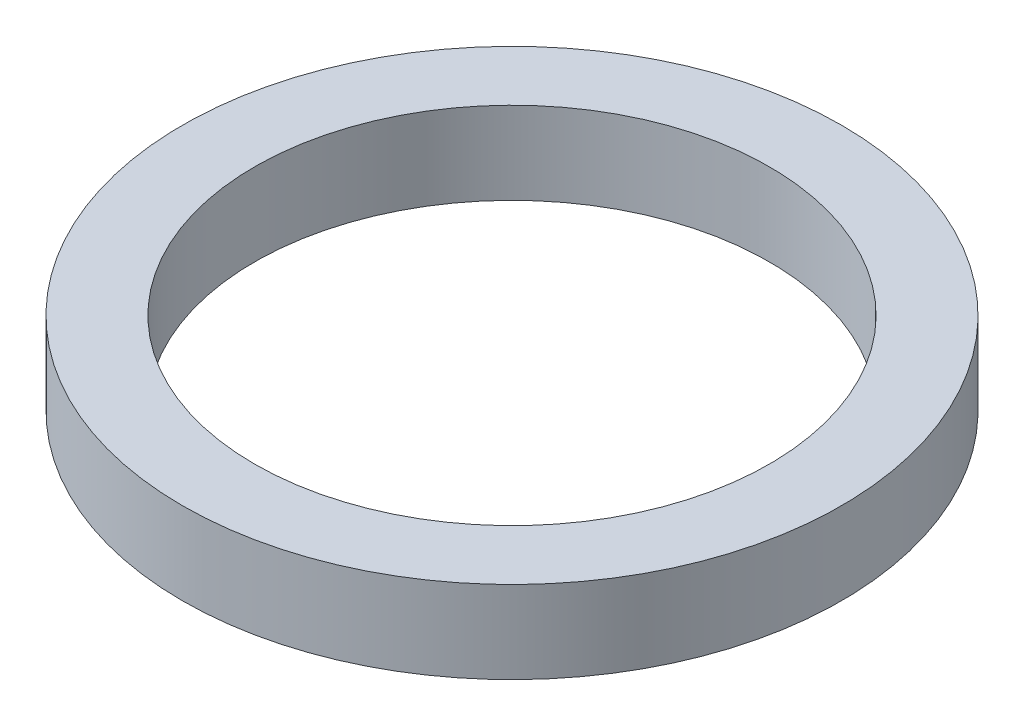
ISO-10303-21;
HEADER;
FILE_DESCRIPTION(('STEP AP214'),'2;1');
FILE_NAME('part.step','',(''),(''),'','','');
FILE_SCHEMA(('AUTOMOTIVE_DESIGN { 1 0 10303 214 1 1 1 1 }'));
ENDSEC;
DATA;
#1=APPLICATION_CONTEXT('core data for automotive mechanical design processes');
#2=APPLICATION_PROTOCOL_DEFINITION('international standard','automotive_design',2000,#1);
#3=PRODUCT_CONTEXT('',#1,'mechanical');
#4=PRODUCT('Part','Part','',(#3));
#5=PRODUCT_RELATED_PRODUCT_CATEGORY('part','',(#4));
#6=PRODUCT_DEFINITION_FORMATION('','',#4);
#7=PRODUCT_DEFINITION_CONTEXT('part definition',#1,'design');
#8=PRODUCT_DEFINITION('design','',#6,#7);
#9=PRODUCT_DEFINITION_SHAPE('','',#8);
#10=(LENGTH_UNIT() NAMED_UNIT(*) SI_UNIT(.MILLI.,.METRE.));
#11=(NAMED_UNIT(*) PLANE_ANGLE_UNIT() SI_UNIT($,.RADIAN.));
#12=(NAMED_UNIT(*) SI_UNIT($,.STERADIAN.) SOLID_ANGLE_UNIT());
#13=UNCERTAINTY_MEASURE_WITH_UNIT(LENGTH_MEASURE(1.E-05),#10,'distance_accuracy_value','');
#14=(GEOMETRIC_REPRESENTATION_CONTEXT(3) GLOBAL_UNCERTAINTY_ASSIGNED_CONTEXT((#13)) GLOBAL_UNIT_ASSIGNED_CONTEXT((#10,
#11,#12)) REPRESENTATION_CONTEXT('',''));
#15=CARTESIAN_POINT('',(0.,0.,0.));
#16=DIRECTION('',(0.,0.,1.));
#17=DIRECTION('',(1.,0.,0.));
#18=AXIS2_PLACEMENT_3D('',#15,#16,#17);
#19=CARTESIAN_POINT('',(-0.499999999999999,9.99999999999999,0.));
#20=DIRECTION('',(0.,1.,0.));
#21=DIRECTION('',(0.,0.,1.));
#22=AXIS2_PLACEMENT_3D('',#19,#20,#21);
#23=CYLINDRICAL_SURFACE('',#22,16.);
#24=CARTESIAN_POINT('',(-0.499999999999999,9.99999999999999,0.));
#25=DIRECTION('',(0.,1.,0.));
#26=DIRECTION('',(0.,0.,1.));
#27=AXIS2_PLACEMENT_3D('',#24,#25,#26);
#28=CIRCLE('',#27,16.);
#29=CARTESIAN_POINT('',(-0.499999999999999,9.99999999999999,16.));
#30=VERTEX_POINT('',#29);
#31=EDGE_CURVE('E11',#30,#30,#28,.T.);
#32=ORIENTED_EDGE('',*,*,#31,.T.);
#33=EDGE_LOOP('',(#32));
#34=FACE_BOUND('',#33,.T.);
#35=CARTESIAN_POINT('',(-0.499999999999999,14.,0.));
#36=DIRECTION('',(0.,1.,0.));
#37=DIRECTION('',(0.,0.,1.));
#38=AXIS2_PLACEMENT_3D('',#35,#36,#37);
#39=CIRCLE('',#38,16.);
#40=CARTESIAN_POINT('',(-0.499999999999999,14.,16.));
#41=VERTEX_POINT('',#40);
#42=EDGE_CURVE('E46',#41,#41,#39,.T.);
#43=ORIENTED_EDGE('',*,*,#42,.F.);
#44=EDGE_LOOP('',(#43));
#45=FACE_BOUND('',#44,.T.);
#46=ADVANCED_FACE('F43',(#34,#45),#23,.T.);
#47=CARTESIAN_POINT('',(-0.499999999999999,9.99999999999999,0.));
#48=DIRECTION('',(0.,1.,0.));
#49=DIRECTION('',(0.,0.,1.));
#50=AXIS2_PLACEMENT_3D('',#47,#48,#49);
#51=PLANE('',#50);
#52=CARTESIAN_POINT('',(-0.499999999999999,9.99999999999999,0.));
#53=DIRECTION('',(0.,1.,0.));
#54=DIRECTION('',(0.,0.,1.));
#55=AXIS2_PLACEMENT_3D('',#52,#53,#54);
#56=CIRCLE('',#55,12.5);
#57=CARTESIAN_POINT('',(-0.499999999999999,9.99999999999999,12.5));
#58=VERTEX_POINT('',#57);
#59=EDGE_CURVE('E52',#58,#58,#56,.T.);
#60=ORIENTED_EDGE('',*,*,#59,.T.);
#61=EDGE_LOOP('',(#60));
#62=FACE_BOUND('',#61,.T.);
#63=ORIENTED_EDGE('',*,*,#31,.F.);
#64=EDGE_LOOP('',(#63));
#65=FACE_BOUND('',#64,.T.);
#66=ADVANCED_FACE('F61',(#62,#65),#51,.F.);
#67=CARTESIAN_POINT('',(-0.499999999999999,14.,0.));
#68=DIRECTION('',(0.,1.,0.));
#69=DIRECTION('',(0.,0.,1.));
#70=AXIS2_PLACEMENT_3D('',#67,#68,#69);
#71=PLANE('',#70);
#72=CARTESIAN_POINT('',(-0.499999999999999,14.,0.));
#73=DIRECTION('',(0.,1.,0.));
#74=DIRECTION('',(0.,0.,1.));
#75=AXIS2_PLACEMENT_3D('',#72,#73,#74);
#76=CIRCLE('',#75,12.5);
#77=CARTESIAN_POINT('',(-0.499999999999999,14.,12.5));
#78=VERTEX_POINT('',#77);
#79=EDGE_CURVE('E54',#78,#78,#76,.T.);
#80=ORIENTED_EDGE('',*,*,#79,.F.);
#81=EDGE_LOOP('',(#80));
#82=FACE_BOUND('',#81,.T.);
#83=ORIENTED_EDGE('',*,*,#42,.T.);
#84=EDGE_LOOP('',(#83));
#85=FACE_BOUND('',#84,.T.);
#86=ADVANCED_FACE('F70',(#82,#85),#71,.T.);
#87=CARTESIAN_POINT('',(-0.499999999999999,9.99999999999999,0.));
#88=DIRECTION('',(0.,1.,0.));
#89=DIRECTION('',(0.,0.,1.));
#90=AXIS2_PLACEMENT_3D('',#87,#88,#89);
#91=CYLINDRICAL_SURFACE('',#90,12.5);
#92=ORIENTED_EDGE('',*,*,#59,.F.);
#93=EDGE_LOOP('',(#92));
#94=FACE_BOUND('',#93,.T.);
#95=ORIENTED_EDGE('',*,*,#79,.T.);
#96=EDGE_LOOP('',(#95));
#97=FACE_BOUND('',#96,.T.);
#98=ADVANCED_FACE('F63',(#94,#97),#91,.F.);
#99=CLOSED_SHELL('',(#46,#66,#86,#98));
#100=MANIFOLD_SOLID_BREP('B2',#99);
#101=ADVANCED_BREP_SHAPE_REPRESENTATION('',(#18,#100),#14);
#102=SHAPE_DEFINITION_REPRESENTATION(#9,#101);
ENDSEC;
END-ISO-10303-21;
